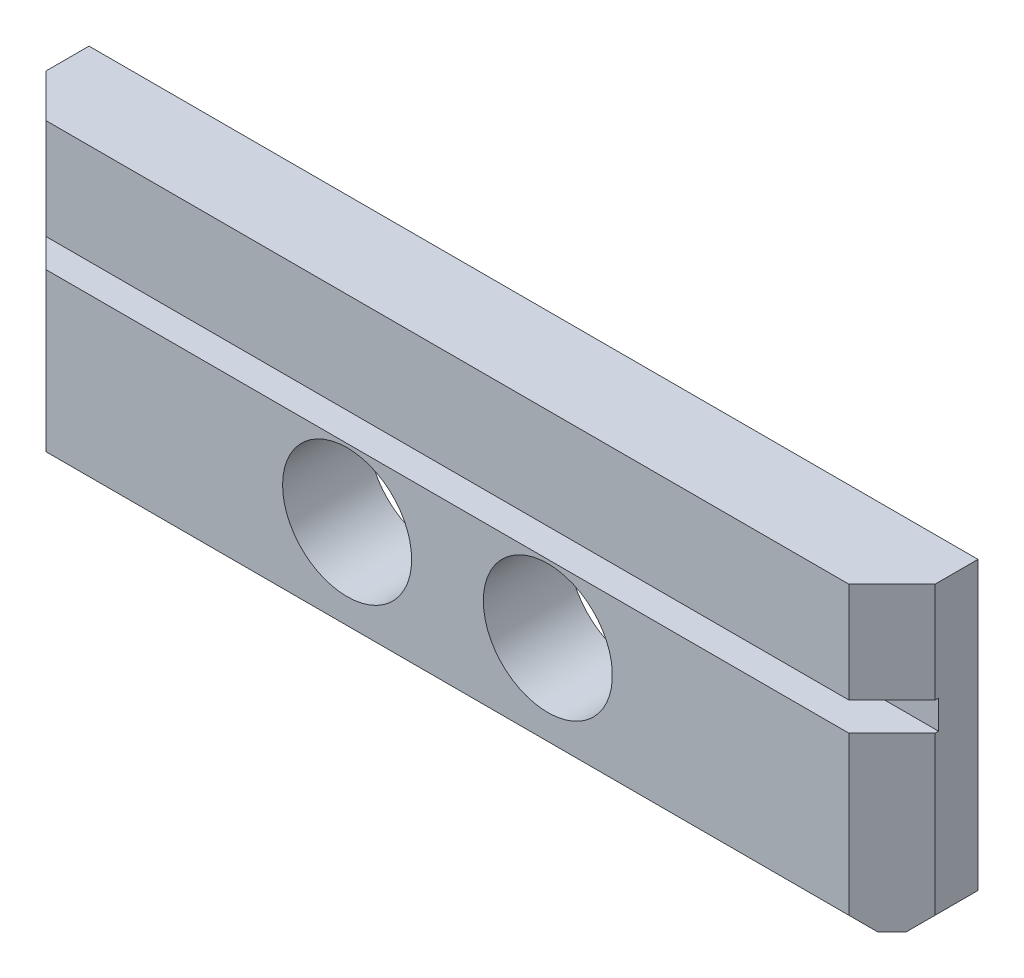
ISO-10303-21;
HEADER;
FILE_DESCRIPTION(('STEP AP214'),'2;1');
FILE_NAME('part.step','',(''),(''),'','','');
FILE_SCHEMA(('AUTOMOTIVE_DESIGN { 1 0 10303 214 1 1 1 1 }'));
ENDSEC;
DATA;
#1=APPLICATION_CONTEXT('core data for automotive mechanical design processes');
#2=APPLICATION_PROTOCOL_DEFINITION('international standard','automotive_design',2000,#1);
#3=PRODUCT_CONTEXT('',#1,'mechanical');
#4=PRODUCT('Part','Part','',(#3));
#5=PRODUCT_RELATED_PRODUCT_CATEGORY('part','',(#4));
#6=PRODUCT_DEFINITION_FORMATION('','',#4);
#7=PRODUCT_DEFINITION_CONTEXT('part definition',#1,'design');
#8=PRODUCT_DEFINITION('design','',#6,#7);
#9=PRODUCT_DEFINITION_SHAPE('','',#8);
#10=(LENGTH_UNIT() NAMED_UNIT(*) SI_UNIT(.MILLI.,.METRE.));
#11=(NAMED_UNIT(*) PLANE_ANGLE_UNIT() SI_UNIT($,.RADIAN.));
#12=(NAMED_UNIT(*) SI_UNIT($,.STERADIAN.) SOLID_ANGLE_UNIT());
#13=UNCERTAINTY_MEASURE_WITH_UNIT(LENGTH_MEASURE(1.E-05),#10,'distance_accuracy_value','');
#14=(GEOMETRIC_REPRESENTATION_CONTEXT(3) GLOBAL_UNCERTAINTY_ASSIGNED_CONTEXT((#13)) GLOBAL_UNIT_ASSIGNED_CONTEXT((#10,
#11,#12)) REPRESENTATION_CONTEXT('',''));
#15=CARTESIAN_POINT('',(0.,0.,0.));
#16=DIRECTION('',(0.,0.,1.));
#17=DIRECTION('',(1.,0.,0.));
#18=AXIS2_PLACEMENT_3D('',#15,#16,#17);
#19=CARTESIAN_POINT('',(-196.85,134.9502,-1.6002));
#20=DIRECTION('',(0.,0.,-1.));
#21=DIRECTION('',(-1.,0.,0.));
#22=AXIS2_PLACEMENT_3D('',#19,#20,#21);
#23=PLANE('',#22);
#24=DIRECTION('',(0.,-1.,0.));
#25=VECTOR('',#24,1.);
#26=CARTESIAN_POINT('',(-177.8,134.9502,-1.6002));
#27=LINE('',#26,#25);
#28=CARTESIAN_POINT('',(-177.8,134.9502,-1.6002));
#29=VERTEX_POINT('',#28);
#30=CARTESIAN_POINT('',(-177.8,90.5002,-1.6002));
#31=VERTEX_POINT('',#30);
#32=EDGE_CURVE('E219',#29,#31,#27,.T.);
#33=ORIENTED_EDGE('',*,*,#32,.T.);
#34=DIRECTION('',(1.,0.,0.));
#35=VECTOR('',#34,1.);
#36=CARTESIAN_POINT('',(-196.85,90.5002,-1.6002));
#37=LINE('',#36,#35);
#38=CARTESIAN_POINT('',(177.8,90.5002,-1.6002));
#39=VERTEX_POINT('',#38);
#40=EDGE_CURVE('E170',#31,#39,#37,.T.);
#41=ORIENTED_EDGE('',*,*,#40,.T.);
#42=DIRECTION('',(0.,1.,0.));
#43=VECTOR('',#42,1.);
#44=CARTESIAN_POINT('',(177.8,134.9502,-1.6002));
#45=LINE('',#44,#43);
#46=CARTESIAN_POINT('',(177.8,134.9502,-1.60020000000001));
#47=VERTEX_POINT('',#46);
#48=EDGE_CURVE('E222',#39,#47,#45,.T.);
#49=ORIENTED_EDGE('',*,*,#48,.T.);
#50=DIRECTION('',(1.,0.,0.));
#51=VECTOR('',#50,1.);
#52=CARTESIAN_POINT('',(-196.85,134.9502,-1.6002));
#53=LINE('',#52,#51);
#54=EDGE_CURVE('E196',#29,#47,#53,.T.);
#55=ORIENTED_EDGE('',*,*,#54,.F.);
#56=EDGE_LOOP('',(#33,#41,#49,#55));
#57=FACE_BOUND('',#56,.T.);
#58=ADVANCED_FACE('F33',(#57),#23,.F.);
#59=CARTESIAN_POINT('',(196.85,134.9502,-20.6502));
#60=DIRECTION('',(-0.707106781186547,0.,-0.707106781186548));
#61=DIRECTION('',(-0.707106781186548,0.,0.707106781186547));
#62=AXIS2_PLACEMENT_3D('',#59,#60,#61);
#63=PLANE('',#62);
#64=DIRECTION('',(0.707106781186548,0.,-0.707106781186547));
#65=VECTOR('',#64,1.);
#66=CARTESIAN_POINT('',(196.85,90.5002,-20.6502));
#67=LINE('',#66,#65);
#68=CARTESIAN_POINT('',(196.85,90.5002,-20.6502));
#69=VERTEX_POINT('',#68);
#70=EDGE_CURVE('E175',#69,#39,#67,.F.);
#71=ORIENTED_EDGE('',*,*,#70,.F.);
#72=DIRECTION('',(0.,-1.,0.));
#73=VECTOR('',#72,1.);
#74=CARTESIAN_POINT('',(196.85,134.9502,-20.6502));
#75=LINE('',#74,#73);
#76=CARTESIAN_POINT('',(196.85,134.9502,-20.6501999999999));
#77=VERTEX_POINT('',#76);
#78=EDGE_CURVE('E209',#77,#69,#75,.T.);
#79=ORIENTED_EDGE('',*,*,#78,.F.);
#80=DIRECTION('',(-0.707106781186548,0.,0.707106781186547));
#81=VECTOR('',#80,1.);
#82=CARTESIAN_POINT('',(-9.5250000000005,134.9502,185.7248));
#83=LINE('',#82,#81);
#84=EDGE_CURVE('E228',#47,#77,#83,.F.);
#85=ORIENTED_EDGE('',*,*,#84,.F.);
#86=ORIENTED_EDGE('',*,*,#48,.F.);
#87=EDGE_LOOP('',(#71,#79,#85,#86));
#88=FACE_BOUND('',#87,.T.);
#89=ADVANCED_FACE('F276',(#88),#63,.F.);
#90=CARTESIAN_POINT('',(-177.8,134.9502,-1.6002));
#91=DIRECTION('',(0.707106781186548,0.,-0.707106781186547));
#92=DIRECTION('',(-0.707106781186547,0.,-0.707106781186548));
#93=AXIS2_PLACEMENT_3D('',#90,#91,#92);
#94=PLANE('',#93);
#95=DIRECTION('',(0.707106781186547,0.,0.707106781186548));
#96=VECTOR('',#95,1.);
#97=CARTESIAN_POINT('',(-177.8,90.5002,-1.6002));
#98=LINE('',#97,#96);
#99=CARTESIAN_POINT('',(-196.85,90.5002,-20.6502000000001));
#100=VERTEX_POINT('',#99);
#101=EDGE_CURVE('E41',#31,#100,#98,.F.);
#102=ORIENTED_EDGE('',*,*,#101,.F.);
#103=ORIENTED_EDGE('',*,*,#32,.F.);
#104=DIRECTION('',(-0.707106781186547,0.,-0.707106781186548));
#105=VECTOR('',#104,1.);
#106=CARTESIAN_POINT('',(-187.325,134.9502,-11.1252));
#107=LINE('',#106,#105);
#108=CARTESIAN_POINT('',(-196.85,134.9502,-20.6502000000001));
#109=VERTEX_POINT('',#108);
#110=EDGE_CURVE('E226',#109,#29,#107,.F.);
#111=ORIENTED_EDGE('',*,*,#110,.F.);
#112=DIRECTION('',(0.,1.,0.));
#113=VECTOR('',#112,1.);
#114=CARTESIAN_POINT('',(-196.85,134.9502,-20.6502000000001));
#115=LINE('',#114,#113);
#116=EDGE_CURVE('E230',#100,#109,#115,.T.);
#117=ORIENTED_EDGE('',*,*,#116,.F.);
#118=EDGE_LOOP('',(#102,#103,#111,#117));
#119=FACE_BOUND('',#118,.T.);
#120=ADVANCED_FACE('F267',(#119),#94,.F.);
#121=CARTESIAN_POINT('',(-196.85,134.9502,-39.7002));
#122=DIRECTION('',(1.,0.,0.));
#123=DIRECTION('',(0.,0.,-1.));
#124=AXIS2_PLACEMENT_3D('',#121,#122,#123);
#125=PLANE('',#124);
#126=DIRECTION('',(0.,-1.,0.));
#127=VECTOR('',#126,1.);
#128=CARTESIAN_POINT('',(-196.85,134.9502,-22.225));
#129=LINE('',#128,#127);
#130=CARTESIAN_POINT('',(-196.85,90.5002,-22.225));
#131=VERTEX_POINT('',#130);
#132=CARTESIAN_POINT('',(-196.85,77.8002,-22.225));
#133=VERTEX_POINT('',#132);
#134=EDGE_CURVE('E143',#131,#133,#129,.T.);
#135=ORIENTED_EDGE('',*,*,#134,.F.);
#136=DIRECTION('',(0.,0.,1.));
#137=VECTOR('',#136,1.);
#138=CARTESIAN_POINT('',(-196.85,90.5002,-39.7002));
#139=LINE('',#138,#137);
#140=EDGE_CURVE('E173',#131,#100,#139,.T.);
#141=ORIENTED_EDGE('',*,*,#140,.T.);
#142=ORIENTED_EDGE('',*,*,#116,.T.);
#143=DIRECTION('',(0.,0.,1.));
#144=VECTOR('',#143,1.);
#145=CARTESIAN_POINT('',(-196.85,134.9502,-39.7002));
#146=LINE('',#145,#144);
#147=CARTESIAN_POINT('',(-196.85,134.9502,-39.7002));
#148=VERTEX_POINT('',#147);
#149=EDGE_CURVE('E193',#148,#109,#146,.T.);
#150=ORIENTED_EDGE('',*,*,#149,.F.);
#151=DIRECTION('',(0.,-1.,0.));
#152=VECTOR('',#151,1.);
#153=CARTESIAN_POINT('',(-196.85,134.9502,-39.7002));
#154=LINE('',#153,#152);
#155=CARTESIAN_POINT('',(-196.85,7.95019999999999,-39.7002));
#156=VERTEX_POINT('',#155);
#157=EDGE_CURVE('E203',#148,#156,#154,.T.);
#158=ORIENTED_EDGE('',*,*,#157,.T.);
#159=DIRECTION('',(0.,0.,1.));
#160=VECTOR('',#159,1.);
#161=CARTESIAN_POINT('',(-196.85,7.95019999999999,-39.7002));
#162=LINE('',#161,#160);
#163=CARTESIAN_POINT('',(-196.85,7.95019999999999,-20.6502000000001));
#164=VERTEX_POINT('',#163);
#165=EDGE_CURVE('E232',#156,#164,#162,.T.);
#166=ORIENTED_EDGE('',*,*,#165,.T.);
#167=CARTESIAN_POINT('',(-196.85,77.8002,-20.6502000000001));
#168=VERTEX_POINT('',#167);
#169=EDGE_CURVE('E160',#164,#168,#115,.T.);
#170=ORIENTED_EDGE('',*,*,#169,.T.);
#171=DIRECTION('',(0.,0.,-1.));
#172=VECTOR('',#171,1.);
#173=CARTESIAN_POINT('',(-196.85,77.8002,-39.7002));
#174=LINE('',#173,#172);
#175=EDGE_CURVE('E48',#168,#133,#174,.T.);
#176=ORIENTED_EDGE('',*,*,#175,.T.);
#177=EDGE_LOOP('',(#135,#141,#142,#150,#158,#166,#170,#176));
#178=FACE_BOUND('',#177,.T.);
#179=ADVANCED_FACE('F35',(#178),#125,.F.);
#180=CARTESIAN_POINT('',(44.45,47.625,-1.6002));
#181=DIRECTION('',(0.,0.,-1.));
#182=DIRECTION('',(-1.,0.,0.));
#183=AXIS2_PLACEMENT_3D('',#180,#181,#182);
#184=CIRCLE('',#183,28.575);
#185=CARTESIAN_POINT('',(15.875,47.625,-1.6002));
#186=VERTEX_POINT('',#185);
#187=EDGE_CURVE('E181',#186,#186,#184,.T.);
#188=ORIENTED_EDGE('',*,*,#187,.T.);
#189=EDGE_LOOP('',(#188));
#190=FACE_BOUND('',#189,.T.);
#191=CARTESIAN_POINT('',(-44.45,47.625,-1.6002));
#192=DIRECTION('',(0.,0.,-1.));
#193=DIRECTION('',(-1.,0.,0.));
#194=AXIS2_PLACEMENT_3D('',#191,#192,#193);
#195=CIRCLE('',#194,28.575);
#196=CARTESIAN_POINT('',(-73.025,47.625,-1.6002));
#197=VERTEX_POINT('',#196);
#198=EDGE_CURVE('E187',#197,#197,#195,.T.);
#199=ORIENTED_EDGE('',*,*,#198,.T.);
#200=EDGE_LOOP('',(#199));
#201=FACE_BOUND('',#200,.T.);
#202=CARTESIAN_POINT('',(177.8,7.95020000000001,-1.6002));
#203=VERTEX_POINT('',#202);
#204=CARTESIAN_POINT('',(177.8,77.8002,-1.6002));
#205=VERTEX_POINT('',#204);
#206=EDGE_CURVE('E223',#203,#205,#45,.T.);
#207=ORIENTED_EDGE('',*,*,#206,.T.);
#208=DIRECTION('',(-1.,0.,0.));
#209=VECTOR('',#208,1.);
#210=CARTESIAN_POINT('',(-196.85,77.8002,-1.6002));
#211=LINE('',#210,#209);
#212=CARTESIAN_POINT('',(-177.8,77.8002,-1.6002));
#213=VERTEX_POINT('',#212);
#214=EDGE_CURVE('E162',#205,#213,#211,.T.);
#215=ORIENTED_EDGE('',*,*,#214,.T.);
#216=CARTESIAN_POINT('',(-177.8,7.95019999999998,-1.6002));
#217=VERTEX_POINT('',#216);
#218=EDGE_CURVE('E218',#213,#217,#27,.T.);
#219=ORIENTED_EDGE('',*,*,#218,.T.);
#220=DIRECTION('',(1.,0.,0.));
#221=VECTOR('',#220,1.);
#222=CARTESIAN_POINT('',(-196.85,7.95019999999999,-1.6002));
#223=LINE('',#222,#221);
#224=EDGE_CURVE('E249',#217,#203,#223,.T.);
#225=ORIENTED_EDGE('',*,*,#224,.T.);
#226=EDGE_LOOP('',(#207,#215,#219,#225));
#227=FACE_BOUND('',#226,.T.);
#228=ADVANCED_FACE('F305',(#190,#201,#227),#23,.F.);
#229=CARTESIAN_POINT('',(196.85,134.9502,-39.7002));
#230=DIRECTION('',(-1.,0.,0.));
#231=DIRECTION('',(0.,0.,1.));
#232=AXIS2_PLACEMENT_3D('',#229,#230,#231);
#233=PLANE('',#232);
#234=ORIENTED_EDGE('',*,*,#78,.T.);
#235=DIRECTION('',(0.,0.,-1.));
#236=VECTOR('',#235,1.);
#237=CARTESIAN_POINT('',(196.85,90.5002,-39.7002));
#238=LINE('',#237,#236);
#239=CARTESIAN_POINT('',(196.85,90.5002,-22.225));
#240=VERTEX_POINT('',#239);
#241=EDGE_CURVE('E152',#69,#240,#238,.T.);
#242=ORIENTED_EDGE('',*,*,#241,.T.);
#243=DIRECTION('',(0.,1.,0.));
#244=VECTOR('',#243,1.);
#245=CARTESIAN_POINT('',(196.85,134.9502,-22.225));
#246=LINE('',#245,#244);
#247=CARTESIAN_POINT('',(196.85,77.8002,-22.225));
#248=VERTEX_POINT('',#247);
#249=EDGE_CURVE('E11',#248,#240,#246,.T.);
#250=ORIENTED_EDGE('',*,*,#249,.F.);
#251=DIRECTION('',(0.,0.,1.));
#252=VECTOR('',#251,1.);
#253=CARTESIAN_POINT('',(196.85,77.8002,-39.7002));
#254=LINE('',#253,#252);
#255=CARTESIAN_POINT('',(196.85,77.8002,-20.6502));
#256=VERTEX_POINT('',#255);
#257=EDGE_CURVE('E155',#248,#256,#254,.T.);
#258=ORIENTED_EDGE('',*,*,#257,.T.);
#259=CARTESIAN_POINT('',(196.85,7.95019999999998,-20.6502));
#260=VERTEX_POINT('',#259);
#261=EDGE_CURVE('E56',#256,#260,#75,.T.);
#262=ORIENTED_EDGE('',*,*,#261,.T.);
#263=DIRECTION('',(0.,0.,-1.));
#264=VECTOR('',#263,1.);
#265=CARTESIAN_POINT('',(196.85,7.95019999999999,-39.7002));
#266=LINE('',#265,#264);
#267=CARTESIAN_POINT('',(196.85,7.95019999999999,-39.7002));
#268=VERTEX_POINT('',#267);
#269=EDGE_CURVE('E256',#260,#268,#266,.T.);
#270=ORIENTED_EDGE('',*,*,#269,.T.);
#271=DIRECTION('',(0.,-1.,0.));
#272=VECTOR('',#271,1.);
#273=CARTESIAN_POINT('',(196.85,134.9502,-39.7002));
#274=LINE('',#273,#272);
#275=CARTESIAN_POINT('',(196.85,134.9502,-39.7002));
#276=VERTEX_POINT('',#275);
#277=EDGE_CURVE('E206',#276,#268,#274,.T.);
#278=ORIENTED_EDGE('',*,*,#277,.F.);
#279=DIRECTION('',(0.,0.,-1.));
#280=VECTOR('',#279,1.);
#281=CARTESIAN_POINT('',(196.85,134.9502,-39.7002));
#282=LINE('',#281,#280);
#283=EDGE_CURVE('E199',#77,#276,#282,.T.);
#284=ORIENTED_EDGE('',*,*,#283,.F.);
#285=EDGE_LOOP('',(#234,#242,#250,#258,#262,#270,#278,#284));
#286=FACE_BOUND('',#285,.T.);
#287=ADVANCED_FACE('F280',(#286),#233,.F.);
#288=CARTESIAN_POINT('',(-196.85,134.9502,-39.7002));
#289=DIRECTION('',(0.,0.,1.));
#290=DIRECTION('',(1.,0.,0.));
#291=AXIS2_PLACEMENT_3D('',#288,#289,#290);
#292=PLANE('',#291);
#293=CARTESIAN_POINT('',(44.45,47.625,-39.7002));
#294=DIRECTION('',(0.,0.,1.));
#295=DIRECTION('',(-1.,0.,0.));
#296=AXIS2_PLACEMENT_3D('',#293,#294,#295);
#297=CIRCLE('',#296,28.575);
#298=CARTESIAN_POINT('',(15.875,47.625,-39.7002));
#299=VERTEX_POINT('',#298);
#300=EDGE_CURVE('E151',#299,#299,#297,.T.);
#301=ORIENTED_EDGE('',*,*,#300,.T.);
#302=EDGE_LOOP('',(#301));
#303=FACE_BOUND('',#302,.T.);
#304=CARTESIAN_POINT('',(-44.45,47.625,-39.7002));
#305=DIRECTION('',(0.,0.,1.));
#306=DIRECTION('',(1.,0.,0.));
#307=AXIS2_PLACEMENT_3D('',#304,#305,#306);
#308=CIRCLE('',#307,28.575);
#309=CARTESIAN_POINT('',(-15.875,47.625,-39.7002));
#310=VERTEX_POINT('',#309);
#311=EDGE_CURVE('E184',#310,#310,#308,.T.);
#312=ORIENTED_EDGE('',*,*,#311,.T.);
#313=EDGE_LOOP('',(#312));
#314=FACE_BOUND('',#313,.T.);
#315=DIRECTION('',(-1.,0.,0.));
#316=VECTOR('',#315,1.);
#317=CARTESIAN_POINT('',(-196.85,1.6002,-39.7002));
#318=LINE('',#317,#316);
#319=CARTESIAN_POINT('',(190.5,1.6002,-39.7002));
#320=VERTEX_POINT('',#319);
#321=CARTESIAN_POINT('',(-190.5,1.6002,-39.7002));
#322=VERTEX_POINT('',#321);
#323=EDGE_CURVE('E190',#320,#322,#318,.T.);
#324=ORIENTED_EDGE('',*,*,#323,.T.);
#325=DIRECTION('',(0.707106781186549,-0.707106781186546,0.));
#326=VECTOR('',#325,1.);
#327=CARTESIAN_POINT('',(-196.85,7.95019999999999,-39.7002));
#328=LINE('',#327,#326);
#329=EDGE_CURVE('E247',#322,#156,#328,.F.);
#330=ORIENTED_EDGE('',*,*,#329,.T.);
#331=ORIENTED_EDGE('',*,*,#157,.F.);
#332=DIRECTION('',(-1.,0.,0.));
#333=VECTOR('',#332,1.);
#334=CARTESIAN_POINT('',(-196.85,134.9502,-39.7002));
#335=LINE('',#334,#333);
#336=EDGE_CURVE('E201',#276,#148,#335,.T.);
#337=ORIENTED_EDGE('',*,*,#336,.F.);
#338=ORIENTED_EDGE('',*,*,#277,.T.);
#339=DIRECTION('',(0.707106781186549,0.707106781186546,0.));
#340=VECTOR('',#339,1.);
#341=CARTESIAN_POINT('',(196.85,7.95019999999999,-39.7002));
#342=LINE('',#341,#340);
#343=EDGE_CURVE('E245',#268,#320,#342,.F.);
#344=ORIENTED_EDGE('',*,*,#343,.T.);
#345=EDGE_LOOP('',(#324,#330,#331,#337,#338,#344));
#346=FACE_BOUND('',#345,.T.);
#347=ADVANCED_FACE('F285',(#303,#314,#346),#292,.F.);
#348=CARTESIAN_POINT('',(-196.85,134.9502,-1.6002));
#349=DIRECTION('',(0.,1.,0.));
#350=DIRECTION('',(0.,0.,1.));
#351=AXIS2_PLACEMENT_3D('',#348,#349,#350);
#352=PLANE('',#351);
#353=ORIENTED_EDGE('',*,*,#54,.T.);
#354=ORIENTED_EDGE('',*,*,#84,.T.);
#355=ORIENTED_EDGE('',*,*,#283,.T.);
#356=ORIENTED_EDGE('',*,*,#336,.T.);
#357=ORIENTED_EDGE('',*,*,#149,.T.);
#358=ORIENTED_EDGE('',*,*,#110,.T.);
#359=EDGE_LOOP('',(#353,#354,#355,#356,#357,#358));
#360=FACE_BOUND('',#359,.T.);
#361=ADVANCED_FACE('F270',(#360),#352,.T.);
#362=CARTESIAN_POINT('',(-196.85,1.6002,-1.6002));
#363=DIRECTION('',(0.,1.,0.));
#364=DIRECTION('',(0.,0.,1.));
#365=AXIS2_PLACEMENT_3D('',#362,#363,#364);
#366=PLANE('',#365);
#367=DIRECTION('',(0.707106781186547,0.,0.707106781186548));
#368=VECTOR('',#367,1.);
#369=CARTESIAN_POINT('',(-177.8,1.6002,-1.6002));
#370=LINE('',#369,#368);
#371=CARTESIAN_POINT('',(-184.15,1.60020000000002,-7.95019999999998));
#372=VERTEX_POINT('',#371);
#373=CARTESIAN_POINT('',(-190.5,1.6002,-14.3002));
#374=VERTEX_POINT('',#373);
#375=EDGE_CURVE('E212',#372,#374,#370,.F.);
#376=ORIENTED_EDGE('',*,*,#375,.T.);
#377=DIRECTION('',(0.,0.,-1.));
#378=VECTOR('',#377,1.);
#379=CARTESIAN_POINT('',(-190.5,1.6002,-1.6002));
#380=LINE('',#379,#378);
#381=EDGE_CURVE('E243',#374,#322,#380,.T.);
#382=ORIENTED_EDGE('',*,*,#381,.T.);
#383=ORIENTED_EDGE('',*,*,#323,.F.);
#384=DIRECTION('',(0.,0.,1.));
#385=VECTOR('',#384,1.);
#386=CARTESIAN_POINT('',(190.5,1.6002,-1.6002));
#387=LINE('',#386,#385);
#388=CARTESIAN_POINT('',(190.5,1.60019999999999,-14.3002));
#389=VERTEX_POINT('',#388);
#390=EDGE_CURVE('E239',#320,#389,#387,.T.);
#391=ORIENTED_EDGE('',*,*,#390,.T.);
#392=DIRECTION('',(0.707106781186548,0.,-0.707106781186547));
#393=VECTOR('',#392,1.);
#394=CARTESIAN_POINT('',(196.85,1.6002,-20.6502));
#395=LINE('',#394,#393);
#396=CARTESIAN_POINT('',(184.15,1.6002,-7.95020000000003));
#397=VERTEX_POINT('',#396);
#398=EDGE_CURVE('E215',#389,#397,#395,.F.);
#399=ORIENTED_EDGE('',*,*,#398,.T.);
#400=DIRECTION('',(-1.,0.,0.));
#401=VECTOR('',#400,1.);
#402=CARTESIAN_POINT('',(-196.85,1.6002,-7.95020000000002));
#403=LINE('',#402,#401);
#404=EDGE_CURVE('E241',#397,#372,#403,.T.);
#405=ORIENTED_EDGE('',*,*,#404,.T.);
#406=EDGE_LOOP('',(#376,#382,#383,#391,#399,#405));
#407=FACE_BOUND('',#406,.T.);
#408=ADVANCED_FACE('F296',(#407),#366,.F.);
#409=DIRECTION('',(-0.707106781186548,0.,0.707106781186547));
#410=VECTOR('',#409,1.);
#411=CARTESIAN_POINT('',(196.85,77.8002,-20.6502));
#412=LINE('',#411,#410);
#413=EDGE_CURVE('E161',#205,#256,#412,.F.);
#414=ORIENTED_EDGE('',*,*,#413,.F.);
#415=ORIENTED_EDGE('',*,*,#206,.F.);
#416=DIRECTION('',(0.577350269189628,-0.577350269189623,-0.577350269189626));
#417=VECTOR('',#416,1.);
#418=CARTESIAN_POINT('',(148.166666666667,37.583533333333,28.0331333333331));
#419=LINE('',#418,#417);
#420=EDGE_CURVE('E254',#203,#397,#419,.T.);
#421=ORIENTED_EDGE('',*,*,#420,.T.);
#422=ORIENTED_EDGE('',*,*,#398,.F.);
#423=DIRECTION('',(0.577350269189627,0.577350269189624,-0.577350269189626));
#424=VECTOR('',#423,1.);
#425=CARTESIAN_POINT('',(239.183333333333,50.2835333333331,-62.9835333333332));
#426=LINE('',#425,#424);
#427=EDGE_CURVE('E252',#389,#260,#426,.T.);
#428=ORIENTED_EDGE('',*,*,#427,.T.);
#429=ORIENTED_EDGE('',*,*,#261,.F.);
#430=EDGE_LOOP('',(#414,#415,#421,#422,#428,#429));
#431=FACE_BOUND('',#430,.T.);
#432=ADVANCED_FACE('F309',(#431),#63,.F.);
#433=DIRECTION('',(-0.707106781186547,0.,-0.707106781186548));
#434=VECTOR('',#433,1.);
#435=CARTESIAN_POINT('',(-177.8,77.8002,-1.6002));
#436=LINE('',#435,#434);
#437=EDGE_CURVE('E258',#168,#213,#436,.F.);
#438=ORIENTED_EDGE('',*,*,#437,.F.);
#439=ORIENTED_EDGE('',*,*,#169,.F.);
#440=DIRECTION('',(0.577350269189626,-0.577350269189623,0.577350269189628));
#441=VECTOR('',#440,1.);
#442=CARTESIAN_POINT('',(-226.483333333333,37.583533333333,-50.2835333333333));
#443=LINE('',#442,#441);
#444=EDGE_CURVE('E237',#164,#374,#443,.T.);
#445=ORIENTED_EDGE('',*,*,#444,.T.);
#446=ORIENTED_EDGE('',*,*,#375,.F.);
#447=DIRECTION('',(0.577350269189626,0.577350269189624,0.577350269189627));
#448=VECTOR('',#447,1.);
#449=CARTESIAN_POINT('',(-135.466666666667,50.2835333333331,40.7331333333333));
#450=LINE('',#449,#448);
#451=EDGE_CURVE('E234',#372,#217,#450,.T.);
#452=ORIENTED_EDGE('',*,*,#451,.T.);
#453=ORIENTED_EDGE('',*,*,#218,.F.);
#454=EDGE_LOOP('',(#438,#439,#445,#446,#452,#453));
#455=FACE_BOUND('',#454,.T.);
#456=ADVANCED_FACE('F293',(#455),#94,.F.);
#457=CARTESIAN_POINT('',(-196.85,7.95019999999999,-39.7002));
#458=DIRECTION('',(0.707106781186546,0.707106781186549,0.));
#459=DIRECTION('',(-0.707106781186549,0.707106781186546,0.));
#460=AXIS2_PLACEMENT_3D('',#457,#458,#459);
#461=PLANE('',#460);
#462=ORIENTED_EDGE('',*,*,#329,.F.);
#463=ORIENTED_EDGE('',*,*,#381,.F.);
#464=ORIENTED_EDGE('',*,*,#444,.F.);
#465=ORIENTED_EDGE('',*,*,#165,.F.);
#466=EDGE_LOOP('',(#462,#463,#464,#465));
#467=FACE_BOUND('',#466,.T.);
#468=ADVANCED_FACE('F289',(#467),#461,.F.);
#469=CARTESIAN_POINT('',(-196.85,7.95019999999999,-1.6002));
#470=DIRECTION('',(0.,0.707106781186549,-0.707106781186546));
#471=DIRECTION('',(0.,0.707106781186546,0.707106781186549));
#472=AXIS2_PLACEMENT_3D('',#469,#470,#471);
#473=PLANE('',#472);
#474=ORIENTED_EDGE('',*,*,#451,.F.);
#475=ORIENTED_EDGE('',*,*,#404,.F.);
#476=ORIENTED_EDGE('',*,*,#420,.F.);
#477=ORIENTED_EDGE('',*,*,#224,.F.);
#478=EDGE_LOOP('',(#474,#475,#476,#477));
#479=FACE_BOUND('',#478,.T.);
#480=ADVANCED_FACE('F301',(#479),#473,.F.);
#481=CARTESIAN_POINT('',(196.85,7.95019999999999,-39.7002));
#482=DIRECTION('',(-0.707106781186546,0.707106781186549,0.));
#483=DIRECTION('',(-0.707106781186549,-0.707106781186546,0.));
#484=AXIS2_PLACEMENT_3D('',#481,#482,#483);
#485=PLANE('',#484);
#486=ORIENTED_EDGE('',*,*,#427,.F.);
#487=ORIENTED_EDGE('',*,*,#390,.F.);
#488=ORIENTED_EDGE('',*,*,#343,.F.);
#489=ORIENTED_EDGE('',*,*,#269,.F.);
#490=EDGE_LOOP('',(#486,#487,#488,#489));
#491=FACE_BOUND('',#490,.T.);
#492=ADVANCED_FACE('F313',(#491),#485,.F.);
#493=CARTESIAN_POINT('',(-44.45,47.625,-39.7002));
#494=DIRECTION('',(0.,0.,1.));
#495=DIRECTION('',(1.,0.,0.));
#496=AXIS2_PLACEMENT_3D('',#493,#494,#495);
#497=CYLINDRICAL_SURFACE('',#496,28.575);
#498=ORIENTED_EDGE('',*,*,#311,.F.);
#499=EDGE_LOOP('',(#498));
#500=FACE_BOUND('',#499,.T.);
#501=ORIENTED_EDGE('',*,*,#198,.F.);
#502=EDGE_LOOP('',(#501));
#503=FACE_BOUND('',#502,.T.);
#504=ADVANCED_FACE('F315',(#500,#503),#497,.F.);
#505=CARTESIAN_POINT('',(44.45,47.625,-39.7002));
#506=DIRECTION('',(0.,0.,1.));
#507=DIRECTION('',(1.,0.,0.));
#508=AXIS2_PLACEMENT_3D('',#505,#506,#507);
#509=CYLINDRICAL_SURFACE('',#508,28.575);
#510=ORIENTED_EDGE('',*,*,#300,.F.);
#511=EDGE_LOOP('',(#510));
#512=FACE_BOUND('',#511,.T.);
#513=ORIENTED_EDGE('',*,*,#187,.F.);
#514=EDGE_LOOP('',(#513));
#515=FACE_BOUND('',#514,.T.);
#516=ADVANCED_FACE('F321',(#512,#515),#509,.F.);
#517=CARTESIAN_POINT('',(-203.257428940568,77.8002,-22.225));
#518=DIRECTION('',(0.,0.,1.));
#519=DIRECTION('',(1.,0.,0.));
#520=AXIS2_PLACEMENT_3D('',#517,#518,#519);
#521=PLANE('',#520);
#522=ORIENTED_EDGE('',*,*,#134,.T.);
#523=DIRECTION('',(1.,0.,0.));
#524=VECTOR('',#523,1.);
#525=CARTESIAN_POINT('',(-203.257428940568,77.8002,-22.225));
#526=LINE('',#525,#524);
#527=EDGE_CURVE('E145',#133,#248,#526,.T.);
#528=ORIENTED_EDGE('',*,*,#527,.T.);
#529=ORIENTED_EDGE('',*,*,#249,.T.);
#530=DIRECTION('',(-1.,0.,0.));
#531=VECTOR('',#530,1.);
#532=CARTESIAN_POINT('',(-203.257428940568,90.5002,-22.225));
#533=LINE('',#532,#531);
#534=EDGE_CURVE('E148',#240,#131,#533,.T.);
#535=ORIENTED_EDGE('',*,*,#534,.T.);
#536=EDGE_LOOP('',(#522,#528,#529,#535));
#537=FACE_BOUND('',#536,.T.);
#538=ADVANCED_FACE('F144',(#537),#521,.T.);
#539=CARTESIAN_POINT('',(-203.257428940568,90.5002,-22.225));
#540=DIRECTION('',(0.,1.,0.));
#541=DIRECTION('',(0.,0.,1.));
#542=AXIS2_PLACEMENT_3D('',#539,#540,#541);
#543=PLANE('',#542);
#544=ORIENTED_EDGE('',*,*,#70,.T.);
#545=ORIENTED_EDGE('',*,*,#40,.F.);
#546=ORIENTED_EDGE('',*,*,#101,.T.);
#547=ORIENTED_EDGE('',*,*,#140,.F.);
#548=ORIENTED_EDGE('',*,*,#534,.F.);
#549=ORIENTED_EDGE('',*,*,#241,.F.);
#550=EDGE_LOOP('',(#544,#545,#546,#547,#548,#549));
#551=FACE_BOUND('',#550,.T.);
#552=ADVANCED_FACE('F261',(#551),#543,.F.);
#553=CARTESIAN_POINT('',(-203.257428940568,77.8002,-22.225));
#554=DIRECTION('',(0.,-1.,0.));
#555=DIRECTION('',(0.,0.,-1.));
#556=AXIS2_PLACEMENT_3D('',#553,#554,#555);
#557=PLANE('',#556);
#558=ORIENTED_EDGE('',*,*,#527,.F.);
#559=ORIENTED_EDGE('',*,*,#175,.F.);
#560=ORIENTED_EDGE('',*,*,#437,.T.);
#561=ORIENTED_EDGE('',*,*,#214,.F.);
#562=ORIENTED_EDGE('',*,*,#413,.T.);
#563=ORIENTED_EDGE('',*,*,#257,.F.);
#564=EDGE_LOOP('',(#558,#559,#560,#561,#562,#563));
#565=FACE_BOUND('',#564,.T.);
#566=ADVANCED_FACE('F154',(#565),#557,.F.);
#567=CLOSED_SHELL('',(#58,#89,#120,#179,#228,#287,#347,#361,#408,#432,#456,#468,#480,#492,#504,
#516,#538,#552,#566));
#568=MANIFOLD_SOLID_BREP('B2',#567);
#569=ADVANCED_BREP_SHAPE_REPRESENTATION('',(#18,#568),#14);
#570=SHAPE_DEFINITION_REPRESENTATION(#9,#569);
ENDSEC;
END-ISO-10303-21;
